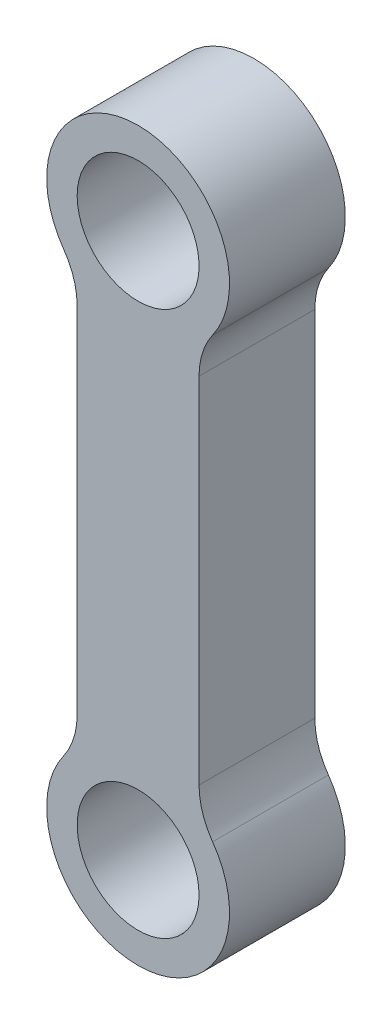
ISO-10303-21;
HEADER;
FILE_DESCRIPTION(('STEP AP214'),'2;1');
FILE_NAME('part.step','',(''),(''),'','','');
FILE_SCHEMA(('AUTOMOTIVE_DESIGN { 1 0 10303 214 1 1 1 1 }'));
ENDSEC;
DATA;
#1=APPLICATION_CONTEXT('core data for automotive mechanical design processes');
#2=APPLICATION_PROTOCOL_DEFINITION('international standard','automotive_design',2000,#1);
#3=PRODUCT_CONTEXT('',#1,'mechanical');
#4=PRODUCT('Part','Part','',(#3));
#5=PRODUCT_RELATED_PRODUCT_CATEGORY('part','',(#4));
#6=PRODUCT_DEFINITION_FORMATION('','',#4);
#7=PRODUCT_DEFINITION_CONTEXT('part definition',#1,'design');
#8=PRODUCT_DEFINITION('design','',#6,#7);
#9=PRODUCT_DEFINITION_SHAPE('','',#8);
#10=(LENGTH_UNIT() NAMED_UNIT(*) SI_UNIT(.MILLI.,.METRE.));
#11=(NAMED_UNIT(*) PLANE_ANGLE_UNIT() SI_UNIT($,.RADIAN.));
#12=(NAMED_UNIT(*) SI_UNIT($,.STERADIAN.) SOLID_ANGLE_UNIT());
#13=UNCERTAINTY_MEASURE_WITH_UNIT(LENGTH_MEASURE(1.E-05),#10,'distance_accuracy_value','');
#14=(GEOMETRIC_REPRESENTATION_CONTEXT(3) GLOBAL_UNCERTAINTY_ASSIGNED_CONTEXT((#13)) GLOBAL_UNIT_ASSIGNED_CONTEXT((#10,
#11,#12)) REPRESENTATION_CONTEXT('',''));
#15=CARTESIAN_POINT('',(0.,0.,0.));
#16=DIRECTION('',(0.,0.,1.));
#17=DIRECTION('',(1.,0.,0.));
#18=AXIS2_PLACEMENT_3D('',#15,#16,#17);
#19=CARTESIAN_POINT('',(0.,22.35,9.5));
#20=DIRECTION('',(0.,0.,-1.));
#21=DIRECTION('',(-1.,0.,0.));
#22=AXIS2_PLACEMENT_3D('',#19,#20,#21);
#23=PLANE('',#22);
#24=CARTESIAN_POINT('',(0.,22.35,9.5));
#25=DIRECTION('',(0.,0.,1.));
#26=DIRECTION('',(-1.,0.,0.));
#27=AXIS2_PLACEMENT_3D('',#24,#25,#26);
#28=CIRCLE('',#27,7.5);
#29=CARTESIAN_POINT('',(6.11111111111112,18.0020900437504,9.5));
#30=VERTEX_POINT('',#29);
#31=CARTESIAN_POINT('',(-6.1111111111111,18.0020900437504,9.5));
#32=VERTEX_POINT('',#31);
#33=EDGE_CURVE('E152',#30,#32,#28,.T.);
#34=ORIENTED_EDGE('',*,*,#33,.T.);
#35=CARTESIAN_POINT('',(-11.,14.5237620787507,9.5));
#36=DIRECTION('',(0.,0.,-1.));
#37=DIRECTION('',(-1.,0.,0.));
#38=AXIS2_PLACEMENT_3D('',#35,#36,#37);
#39=CIRCLE('',#38,6.);
#40=CARTESIAN_POINT('',(-4.99999999999999,14.5237620787507,9.5));
#41=VERTEX_POINT('',#40);
#42=EDGE_CURVE('E98',#32,#41,#39,.T.);
#43=ORIENTED_EDGE('',*,*,#42,.T.);
#44=DIRECTION('',(0.,-1.,0.));
#45=VECTOR('',#44,1.);
#46=CARTESIAN_POINT('',(-4.99999999999999,14.5237620787507,9.5));
#47=LINE('',#46,#45);
#48=CARTESIAN_POINT('',(-5.,-14.5237620787507,9.5));
#49=VERTEX_POINT('',#48);
#50=EDGE_CURVE('E168',#41,#49,#47,.T.);
#51=ORIENTED_EDGE('',*,*,#50,.T.);
#52=CARTESIAN_POINT('',(-11.,-14.5237620787507,9.5));
#53=DIRECTION('',(0.,0.,-1.));
#54=DIRECTION('',(1.,0.,0.));
#55=AXIS2_PLACEMENT_3D('',#52,#53,#54);
#56=CIRCLE('',#55,6.);
#57=CARTESIAN_POINT('',(-6.11111111111111,-18.0020900437504,9.5));
#58=VERTEX_POINT('',#57);
#59=EDGE_CURVE('E177',#49,#58,#56,.T.);
#60=ORIENTED_EDGE('',*,*,#59,.T.);
#61=CARTESIAN_POINT('',(0.,-22.35,9.5));
#62=DIRECTION('',(0.,0.,1.));
#63=DIRECTION('',(1.,0.,0.));
#64=AXIS2_PLACEMENT_3D('',#61,#62,#63);
#65=CIRCLE('',#64,7.5);
#66=CARTESIAN_POINT('',(6.11111111111111,-18.0020900437504,9.5));
#67=VERTEX_POINT('',#66);
#68=EDGE_CURVE('E120',#58,#67,#65,.T.);
#69=ORIENTED_EDGE('',*,*,#68,.T.);
#70=CARTESIAN_POINT('',(11.,-14.5237620787507,9.5));
#71=DIRECTION('',(0.,0.,-1.));
#72=DIRECTION('',(-1.,0.,0.));
#73=AXIS2_PLACEMENT_3D('',#70,#71,#72);
#74=CIRCLE('',#73,6.);
#75=CARTESIAN_POINT('',(5.,-14.5237620787507,9.5));
#76=VERTEX_POINT('',#75);
#77=EDGE_CURVE('E115',#67,#76,#74,.T.);
#78=ORIENTED_EDGE('',*,*,#77,.T.);
#79=DIRECTION('',(0.,1.,0.));
#80=VECTOR('',#79,1.);
#81=CARTESIAN_POINT('',(5.,-14.5237620787507,9.5));
#82=LINE('',#81,#80);
#83=CARTESIAN_POINT('',(5.00000000000001,14.5237620787507,9.5));
#84=VERTEX_POINT('',#83);
#85=EDGE_CURVE('E117',#76,#84,#82,.T.);
#86=ORIENTED_EDGE('',*,*,#85,.T.);
#87=CARTESIAN_POINT('',(11.,14.5237620787507,9.5));
#88=DIRECTION('',(0.,0.,-1.));
#89=DIRECTION('',(1.,0.,0.));
#90=AXIS2_PLACEMENT_3D('',#87,#88,#89);
#91=CIRCLE('',#90,6.);
#92=EDGE_CURVE('E57',#84,#30,#91,.T.);
#93=ORIENTED_EDGE('',*,*,#92,.T.);
#94=EDGE_LOOP('',(#34,#43,#51,#60,#69,#78,#86,#93));
#95=FACE_BOUND('',#94,.T.);
#96=CARTESIAN_POINT('',(0.,-22.35,9.5));
#97=DIRECTION('',(0.,0.,1.));
#98=DIRECTION('',(1.,0.,0.));
#99=AXIS2_PLACEMENT_3D('',#96,#97,#98);
#100=CIRCLE('',#99,5.);
#101=CARTESIAN_POINT('',(5.,-22.35,9.5));
#102=VERTEX_POINT('',#101);
#103=EDGE_CURVE('E139',#102,#102,#100,.T.);
#104=ORIENTED_EDGE('',*,*,#103,.F.);
#105=EDGE_LOOP('',(#104));
#106=FACE_BOUND('',#105,.T.);
#107=CARTESIAN_POINT('',(0.,22.35,9.5));
#108=DIRECTION('',(0.,0.,1.));
#109=DIRECTION('',(-1.,0.,0.));
#110=AXIS2_PLACEMENT_3D('',#107,#108,#109);
#111=CIRCLE('',#110,5.);
#112=CARTESIAN_POINT('',(-4.99999999999999,22.35,9.5));
#113=VERTEX_POINT('',#112);
#114=EDGE_CURVE('E187',#113,#113,#111,.T.);
#115=ORIENTED_EDGE('',*,*,#114,.F.);
#116=EDGE_LOOP('',(#115));
#117=FACE_BOUND('',#116,.T.);
#118=ADVANCED_FACE('F39',(#95,#106,#117),#23,.F.);
#119=CARTESIAN_POINT('',(0.,22.35,0.));
#120=DIRECTION('',(0.,0.,-1.));
#121=DIRECTION('',(-1.,0.,0.));
#122=AXIS2_PLACEMENT_3D('',#119,#120,#121);
#123=PLANE('',#122);
#124=CARTESIAN_POINT('',(0.,-22.35,0.));
#125=DIRECTION('',(0.,0.,1.));
#126=DIRECTION('',(1.,0.,0.));
#127=AXIS2_PLACEMENT_3D('',#124,#125,#126);
#128=CIRCLE('',#127,5.);
#129=CARTESIAN_POINT('',(5.,-22.35,0.));
#130=VERTEX_POINT('',#129);
#131=EDGE_CURVE('E184',#130,#130,#128,.T.);
#132=ORIENTED_EDGE('',*,*,#131,.T.);
#133=EDGE_LOOP('',(#132));
#134=FACE_BOUND('',#133,.T.);
#135=CARTESIAN_POINT('',(0.,22.35,0.));
#136=DIRECTION('',(0.,0.,1.));
#137=DIRECTION('',(-1.,0.,0.));
#138=AXIS2_PLACEMENT_3D('',#135,#136,#137);
#139=CIRCLE('',#138,7.5);
#140=CARTESIAN_POINT('',(6.11111111111112,18.0020900437504,0.));
#141=VERTEX_POINT('',#140);
#142=CARTESIAN_POINT('',(-6.1111111111111,18.0020900437504,0.));
#143=VERTEX_POINT('',#142);
#144=EDGE_CURVE('E136',#141,#143,#139,.T.);
#145=ORIENTED_EDGE('',*,*,#144,.F.);
#146=CARTESIAN_POINT('',(11.,14.5237620787507,0.));
#147=DIRECTION('',(0.,0.,-1.));
#148=DIRECTION('',(1.,0.,0.));
#149=AXIS2_PLACEMENT_3D('',#146,#147,#148);
#150=CIRCLE('',#149,6.);
#151=CARTESIAN_POINT('',(5.00000000000001,14.5237620787507,0.));
#152=VERTEX_POINT('',#151);
#153=EDGE_CURVE('E91',#152,#141,#150,.T.);
#154=ORIENTED_EDGE('',*,*,#153,.F.);
#155=DIRECTION('',(0.,1.,0.));
#156=VECTOR('',#155,1.);
#157=CARTESIAN_POINT('',(5.,-14.5237620787507,0.));
#158=LINE('',#157,#156);
#159=CARTESIAN_POINT('',(5.,-14.5237620787507,0.));
#160=VERTEX_POINT('',#159);
#161=EDGE_CURVE('E82',#160,#152,#158,.T.);
#162=ORIENTED_EDGE('',*,*,#161,.F.);
#163=CARTESIAN_POINT('',(11.,-14.5237620787507,0.));
#164=DIRECTION('',(0.,0.,-1.));
#165=DIRECTION('',(-1.,0.,0.));
#166=AXIS2_PLACEMENT_3D('',#163,#164,#165);
#167=CIRCLE('',#166,6.);
#168=CARTESIAN_POINT('',(6.11111111111111,-18.0020900437504,0.));
#169=VERTEX_POINT('',#168);
#170=EDGE_CURVE('E128',#169,#160,#167,.T.);
#171=ORIENTED_EDGE('',*,*,#170,.F.);
#172=CARTESIAN_POINT('',(0.,-22.35,0.));
#173=DIRECTION('',(0.,0.,1.));
#174=DIRECTION('',(1.,0.,0.));
#175=AXIS2_PLACEMENT_3D('',#172,#173,#174);
#176=CIRCLE('',#175,7.5);
#177=CARTESIAN_POINT('',(-6.11111111111111,-18.0020900437504,0.));
#178=VERTEX_POINT('',#177);
#179=EDGE_CURVE('E147',#178,#169,#176,.T.);
#180=ORIENTED_EDGE('',*,*,#179,.F.);
#181=CARTESIAN_POINT('',(-11.,-14.5237620787507,0.));
#182=DIRECTION('',(0.,0.,-1.));
#183=DIRECTION('',(1.,0.,0.));
#184=AXIS2_PLACEMENT_3D('',#181,#182,#183);
#185=CIRCLE('',#184,6.);
#186=CARTESIAN_POINT('',(-5.,-14.5237620787507,0.));
#187=VERTEX_POINT('',#186);
#188=EDGE_CURVE('E143',#187,#178,#185,.T.);
#189=ORIENTED_EDGE('',*,*,#188,.F.);
#190=DIRECTION('',(0.,-1.,0.));
#191=VECTOR('',#190,1.);
#192=CARTESIAN_POINT('',(-4.99999999999999,14.5237620787507,0.));
#193=LINE('',#192,#191);
#194=CARTESIAN_POINT('',(-4.99999999999999,14.5237620787507,0.));
#195=VERTEX_POINT('',#194);
#196=EDGE_CURVE('E145',#195,#187,#193,.T.);
#197=ORIENTED_EDGE('',*,*,#196,.F.);
#198=CARTESIAN_POINT('',(-11.,14.5237620787507,0.));
#199=DIRECTION('',(0.,0.,-1.));
#200=DIRECTION('',(-1.,0.,0.));
#201=AXIS2_PLACEMENT_3D('',#198,#199,#200);
#202=CIRCLE('',#201,6.);
#203=EDGE_CURVE('E137',#143,#195,#202,.T.);
#204=ORIENTED_EDGE('',*,*,#203,.F.);
#205=EDGE_LOOP('',(#145,#154,#162,#171,#180,#189,#197,#204));
#206=FACE_BOUND('',#205,.T.);
#207=CARTESIAN_POINT('',(0.,22.35,0.));
#208=DIRECTION('',(0.,0.,1.));
#209=DIRECTION('',(-1.,0.,0.));
#210=AXIS2_PLACEMENT_3D('',#207,#208,#209);
#211=CIRCLE('',#210,5.);
#212=CARTESIAN_POINT('',(-4.99999999999999,22.35,0.));
#213=VERTEX_POINT('',#212);
#214=EDGE_CURVE('E192',#213,#213,#211,.T.);
#215=ORIENTED_EDGE('',*,*,#214,.T.);
#216=EDGE_LOOP('',(#215));
#217=FACE_BOUND('',#216,.T.);
#218=ADVANCED_FACE('F169',(#134,#206,#217),#123,.T.);
#219=CARTESIAN_POINT('',(0.,22.35,9.5));
#220=DIRECTION('',(0.,0.,-1.));
#221=DIRECTION('',(-1.,0.,0.));
#222=AXIS2_PLACEMENT_3D('',#219,#220,#221);
#223=CYLINDRICAL_SURFACE('',#222,7.5);
#224=ORIENTED_EDGE('',*,*,#144,.T.);
#225=DIRECTION('',(0.,0.,-1.));
#226=VECTOR('',#225,1.);
#227=CARTESIAN_POINT('',(-6.1111111111111,18.0020900437504,9.5));
#228=LINE('',#227,#226);
#229=EDGE_CURVE('E11',#32,#143,#228,.T.);
#230=ORIENTED_EDGE('',*,*,#229,.F.);
#231=ORIENTED_EDGE('',*,*,#33,.F.);
#232=DIRECTION('',(0.,0.,-1.));
#233=VECTOR('',#232,1.);
#234=CARTESIAN_POINT('',(6.11111111111112,18.0020900437504,9.5));
#235=LINE('',#234,#233);
#236=EDGE_CURVE('E135',#30,#141,#235,.T.);
#237=ORIENTED_EDGE('',*,*,#236,.T.);
#238=EDGE_LOOP('',(#224,#230,#231,#237));
#239=FACE_BOUND('',#238,.T.);
#240=ADVANCED_FACE('F41',(#239),#223,.T.);
#241=CARTESIAN_POINT('',(-11.,14.5237620787507,9.5));
#242=DIRECTION('',(0.,0.,-1.));
#243=DIRECTION('',(-1.,0.,0.));
#244=AXIS2_PLACEMENT_3D('',#241,#242,#243);
#245=CYLINDRICAL_SURFACE('',#244,6.);
#246=ORIENTED_EDGE('',*,*,#203,.T.);
#247=DIRECTION('',(0.,0.,-1.));
#248=VECTOR('',#247,1.);
#249=CARTESIAN_POINT('',(-4.99999999999999,14.5237620787507,9.5));
#250=LINE('',#249,#248);
#251=EDGE_CURVE('E48',#41,#195,#250,.T.);
#252=ORIENTED_EDGE('',*,*,#251,.F.);
#253=ORIENTED_EDGE('',*,*,#42,.F.);
#254=ORIENTED_EDGE('',*,*,#229,.T.);
#255=EDGE_LOOP('',(#246,#252,#253,#254));
#256=FACE_BOUND('',#255,.T.);
#257=ADVANCED_FACE('F223',(#256),#245,.F.);
#258=CARTESIAN_POINT('',(-4.99999999999999,14.5237620787507,9.5));
#259=DIRECTION('',(1.,0.,0.));
#260=DIRECTION('',(0.,1.,0.));
#261=AXIS2_PLACEMENT_3D('',#258,#259,#260);
#262=PLANE('',#261);
#263=ORIENTED_EDGE('',*,*,#196,.T.);
#264=DIRECTION('',(0.,0.,-1.));
#265=VECTOR('',#264,1.);
#266=CARTESIAN_POINT('',(-5.,-14.5237620787507,9.5));
#267=LINE('',#266,#265);
#268=EDGE_CURVE('E156',#49,#187,#267,.T.);
#269=ORIENTED_EDGE('',*,*,#268,.F.);
#270=ORIENTED_EDGE('',*,*,#50,.F.);
#271=ORIENTED_EDGE('',*,*,#251,.T.);
#272=EDGE_LOOP('',(#263,#269,#270,#271));
#273=FACE_BOUND('',#272,.T.);
#274=ADVANCED_FACE('F161',(#273),#262,.F.);
#275=CARTESIAN_POINT('',(-11.,-14.5237620787507,9.5));
#276=DIRECTION('',(0.,0.,-1.));
#277=DIRECTION('',(-1.,0.,0.));
#278=AXIS2_PLACEMENT_3D('',#275,#276,#277);
#279=CYLINDRICAL_SURFACE('',#278,6.);
#280=ORIENTED_EDGE('',*,*,#188,.T.);
#281=DIRECTION('',(0.,0.,-1.));
#282=VECTOR('',#281,1.);
#283=CARTESIAN_POINT('',(-6.11111111111111,-18.0020900437504,9.5));
#284=LINE('',#283,#282);
#285=EDGE_CURVE('E153',#58,#178,#284,.T.);
#286=ORIENTED_EDGE('',*,*,#285,.F.);
#287=ORIENTED_EDGE('',*,*,#59,.F.);
#288=ORIENTED_EDGE('',*,*,#268,.T.);
#289=EDGE_LOOP('',(#280,#286,#287,#288));
#290=FACE_BOUND('',#289,.T.);
#291=ADVANCED_FACE('F172',(#290),#279,.F.);
#292=CARTESIAN_POINT('',(0.,-22.35,9.5));
#293=DIRECTION('',(0.,0.,-1.));
#294=DIRECTION('',(-1.,0.,0.));
#295=AXIS2_PLACEMENT_3D('',#292,#293,#294);
#296=CYLINDRICAL_SURFACE('',#295,7.5);
#297=ORIENTED_EDGE('',*,*,#179,.T.);
#298=DIRECTION('',(0.,0.,-1.));
#299=VECTOR('',#298,1.);
#300=CARTESIAN_POINT('',(6.11111111111111,-18.0020900437504,9.5));
#301=LINE('',#300,#299);
#302=EDGE_CURVE('E130',#67,#169,#301,.T.);
#303=ORIENTED_EDGE('',*,*,#302,.F.);
#304=ORIENTED_EDGE('',*,*,#68,.F.);
#305=ORIENTED_EDGE('',*,*,#285,.T.);
#306=EDGE_LOOP('',(#297,#303,#304,#305));
#307=FACE_BOUND('',#306,.T.);
#308=ADVANCED_FACE('F178',(#307),#296,.T.);
#309=CARTESIAN_POINT('',(11.,-14.5237620787507,9.5));
#310=DIRECTION('',(0.,0.,-1.));
#311=DIRECTION('',(-1.,0.,0.));
#312=AXIS2_PLACEMENT_3D('',#309,#310,#311);
#313=CYLINDRICAL_SURFACE('',#312,6.);
#314=ORIENTED_EDGE('',*,*,#170,.T.);
#315=DIRECTION('',(0.,0.,-1.));
#316=VECTOR('',#315,1.);
#317=CARTESIAN_POINT('',(5.,-14.5237620787507,9.5));
#318=LINE('',#317,#316);
#319=EDGE_CURVE('E121',#76,#160,#318,.T.);
#320=ORIENTED_EDGE('',*,*,#319,.F.);
#321=ORIENTED_EDGE('',*,*,#77,.F.);
#322=ORIENTED_EDGE('',*,*,#302,.T.);
#323=EDGE_LOOP('',(#314,#320,#321,#322));
#324=FACE_BOUND('',#323,.T.);
#325=ADVANCED_FACE('F125',(#324),#313,.F.);
#326=CARTESIAN_POINT('',(5.,-14.5237620787507,9.5));
#327=DIRECTION('',(-1.,0.,0.));
#328=DIRECTION('',(0.,-1.,0.));
#329=AXIS2_PLACEMENT_3D('',#326,#327,#328);
#330=PLANE('',#329);
#331=ORIENTED_EDGE('',*,*,#161,.T.);
#332=DIRECTION('',(0.,0.,-1.));
#333=VECTOR('',#332,1.);
#334=CARTESIAN_POINT('',(5.00000000000001,14.5237620787507,9.5));
#335=LINE('',#334,#333);
#336=EDGE_CURVE('E126',#84,#152,#335,.T.);
#337=ORIENTED_EDGE('',*,*,#336,.F.);
#338=ORIENTED_EDGE('',*,*,#85,.F.);
#339=ORIENTED_EDGE('',*,*,#319,.T.);
#340=EDGE_LOOP('',(#331,#337,#338,#339));
#341=FACE_BOUND('',#340,.T.);
#342=ADVANCED_FACE('F127',(#341),#330,.F.);
#343=CARTESIAN_POINT('',(11.,14.5237620787507,9.5));
#344=DIRECTION('',(0.,0.,-1.));
#345=DIRECTION('',(-1.,0.,0.));
#346=AXIS2_PLACEMENT_3D('',#343,#344,#345);
#347=CYLINDRICAL_SURFACE('',#346,6.);
#348=ORIENTED_EDGE('',*,*,#153,.T.);
#349=ORIENTED_EDGE('',*,*,#236,.F.);
#350=ORIENTED_EDGE('',*,*,#92,.F.);
#351=ORIENTED_EDGE('',*,*,#336,.T.);
#352=EDGE_LOOP('',(#348,#349,#350,#351));
#353=FACE_BOUND('',#352,.T.);
#354=ADVANCED_FACE('F213',(#353),#347,.F.);
#355=CARTESIAN_POINT('',(0.,-22.35,9.5));
#356=DIRECTION('',(0.,0.,-1.));
#357=DIRECTION('',(-1.,0.,0.));
#358=AXIS2_PLACEMENT_3D('',#355,#356,#357);
#359=CYLINDRICAL_SURFACE('',#358,5.);
#360=ORIENTED_EDGE('',*,*,#103,.T.);
#361=EDGE_LOOP('',(#360));
#362=FACE_BOUND('',#361,.T.);
#363=ORIENTED_EDGE('',*,*,#131,.F.);
#364=EDGE_LOOP('',(#363));
#365=FACE_BOUND('',#364,.T.);
#366=ADVANCED_FACE('F210',(#362,#365),#359,.F.);
#367=CARTESIAN_POINT('',(0.,22.35,9.5));
#368=DIRECTION('',(0.,0.,-1.));
#369=DIRECTION('',(-1.,0.,0.));
#370=AXIS2_PLACEMENT_3D('',#367,#368,#369);
#371=CYLINDRICAL_SURFACE('',#370,5.);
#372=ORIENTED_EDGE('',*,*,#114,.T.);
#373=EDGE_LOOP('',(#372));
#374=FACE_BOUND('',#373,.T.);
#375=ORIENTED_EDGE('',*,*,#214,.F.);
#376=EDGE_LOOP('',(#375));
#377=FACE_BOUND('',#376,.T.);
#378=ADVANCED_FACE('F199',(#374,#377),#371,.F.);
#379=CLOSED_SHELL('',(#118,#218,#240,#257,#274,#291,#308,#325,#342,#354,#366,#378));
#380=MANIFOLD_SOLID_BREP('B2',#379);
#381=ADVANCED_BREP_SHAPE_REPRESENTATION('',(#18,#380),#14);
#382=SHAPE_DEFINITION_REPRESENTATION(#9,#381);
ENDSEC;
END-ISO-10303-21;
